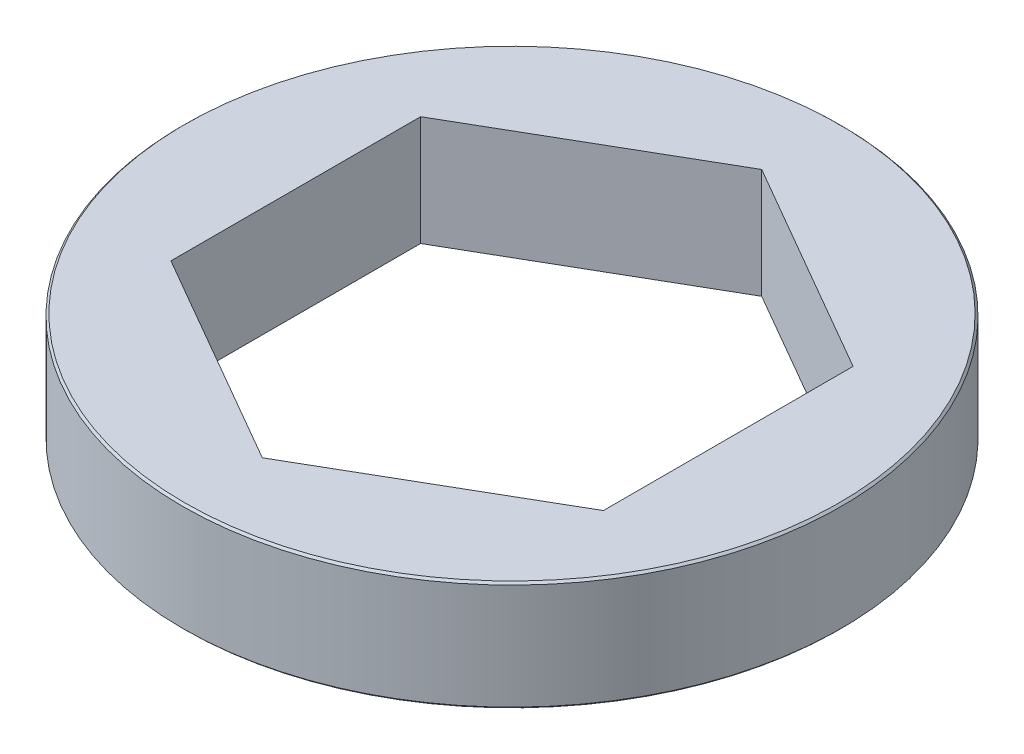
ISO-10303-21;
HEADER;
FILE_DESCRIPTION(('STEP AP214'),'2;1');
FILE_NAME('part.step','',(''),(''),'','','');
FILE_SCHEMA(('AUTOMOTIVE_DESIGN { 1 0 10303 214 1 1 1 1 }'));
ENDSEC;
DATA;
#1=APPLICATION_CONTEXT('core data for automotive mechanical design processes');
#2=APPLICATION_PROTOCOL_DEFINITION('international standard','automotive_design',2000,#1);
#3=PRODUCT_CONTEXT('',#1,'mechanical');
#4=PRODUCT('Part','Part','',(#3));
#5=PRODUCT_RELATED_PRODUCT_CATEGORY('part','',(#4));
#6=PRODUCT_DEFINITION_FORMATION('','',#4);
#7=PRODUCT_DEFINITION_CONTEXT('part definition',#1,'design');
#8=PRODUCT_DEFINITION('design','',#6,#7);
#9=PRODUCT_DEFINITION_SHAPE('','',#8);
#10=(LENGTH_UNIT() NAMED_UNIT(*) SI_UNIT(.MILLI.,.METRE.));
#11=(NAMED_UNIT(*) PLANE_ANGLE_UNIT() SI_UNIT($,.RADIAN.));
#12=(NAMED_UNIT(*) SI_UNIT($,.STERADIAN.) SOLID_ANGLE_UNIT());
#13=UNCERTAINTY_MEASURE_WITH_UNIT(LENGTH_MEASURE(1.E-05),#10,'distance_accuracy_value','');
#14=(GEOMETRIC_REPRESENTATION_CONTEXT(3) GLOBAL_UNCERTAINTY_ASSIGNED_CONTEXT((#13)) GLOBAL_UNIT_ASSIGNED_CONTEXT((#10,
#11,#12)) REPRESENTATION_CONTEXT('',''));
#15=CARTESIAN_POINT('',(0.,0.,0.));
#16=DIRECTION('',(0.,0.,1.));
#17=DIRECTION('',(1.,0.,0.));
#18=AXIS2_PLACEMENT_3D('',#15,#16,#17);
#19=CARTESIAN_POINT('',(0.,3.175,0.));
#20=DIRECTION('',(0.,1.,0.));
#21=DIRECTION('',(0.,0.,1.));
#22=AXIS2_PLACEMENT_3D('',#19,#20,#21);
#23=PLANE('',#22);
#24=CARTESIAN_POINT('',(0.,3.175,0.));
#25=DIRECTION('',(0.,1.,0.));
#26=DIRECTION('',(0.,0.,1.));
#27=AXIS2_PLACEMENT_3D('',#24,#25,#26);
#28=CIRCLE('',#27,9.465);
#29=CARTESIAN_POINT('',(0.,3.175,9.465));
#30=VERTEX_POINT('',#29);
#31=EDGE_CURVE('E41',#30,#30,#28,.T.);
#32=ORIENTED_EDGE('',*,*,#31,.T.);
#33=EDGE_LOOP('',(#32));
#34=FACE_BOUND('',#33,.T.);
#35=DIRECTION('',(-0.866025403784439,0.,0.5));
#36=VECTOR('',#35,1.);
#37=CARTESIAN_POINT('',(0.,3.175,-7.21687836487032));
#38=LINE('',#37,#36);
#39=CARTESIAN_POINT('',(0.,3.175,-7.21687836487032));
#40=VERTEX_POINT('',#39);
#41=CARTESIAN_POINT('',(-6.25,3.175,-3.60843918243516));
#42=VERTEX_POINT('',#41);
#43=EDGE_CURVE('E94',#40,#42,#38,.T.);
#44=ORIENTED_EDGE('',*,*,#43,.F.);
#45=DIRECTION('',(-0.866025403784439,0.,-0.5));
#46=VECTOR('',#45,1.);
#47=CARTESIAN_POINT('',(6.25,3.175,-3.60843918243516));
#48=LINE('',#47,#46);
#49=CARTESIAN_POINT('',(6.25,3.175,-3.60843918243516));
#50=VERTEX_POINT('',#49);
#51=EDGE_CURVE('E86',#50,#40,#48,.T.);
#52=ORIENTED_EDGE('',*,*,#51,.F.);
#53=DIRECTION('',(0.,0.,-1.));
#54=VECTOR('',#53,1.);
#55=CARTESIAN_POINT('',(6.25,3.175,3.60843918243516));
#56=LINE('',#55,#54);
#57=CARTESIAN_POINT('',(6.25,3.175,3.60843918243516));
#58=VERTEX_POINT('',#57);
#59=EDGE_CURVE('E115',#58,#50,#56,.T.);
#60=ORIENTED_EDGE('',*,*,#59,.F.);
#61=DIRECTION('',(0.866025403784439,0.,-0.5));
#62=VECTOR('',#61,1.);
#63=CARTESIAN_POINT('',(0.,3.175,7.21687836487032));
#64=LINE('',#63,#62);
#65=CARTESIAN_POINT('',(0.,3.175,7.21687836487032));
#66=VERTEX_POINT('',#65);
#67=EDGE_CURVE('E113',#66,#58,#64,.T.);
#68=ORIENTED_EDGE('',*,*,#67,.F.);
#69=DIRECTION('',(0.866025403784439,0.,0.5));
#70=VECTOR('',#69,1.);
#71=CARTESIAN_POINT('',(-6.25,3.175,3.60843918243516));
#72=LINE('',#71,#70);
#73=CARTESIAN_POINT('',(-6.25,3.175,3.60843918243516));
#74=VERTEX_POINT('',#73);
#75=EDGE_CURVE('E109',#74,#66,#72,.T.);
#76=ORIENTED_EDGE('',*,*,#75,.F.);
#77=DIRECTION('',(0.,0.,1.));
#78=VECTOR('',#77,1.);
#79=CARTESIAN_POINT('',(-6.25,3.175,-3.60843918243516));
#80=LINE('',#79,#78);
#81=EDGE_CURVE('E107',#42,#74,#80,.T.);
#82=ORIENTED_EDGE('',*,*,#81,.F.);
#83=EDGE_LOOP('',(#44,#52,#60,#68,#76,#82));
#84=FACE_BOUND('',#83,.T.);
#85=ADVANCED_FACE('F33',(#34,#84),#23,.T.);
#86=CARTESIAN_POINT('',(0.,0.,0.));
#87=DIRECTION('',(0.,1.,0.));
#88=DIRECTION('',(0.,0.,1.));
#89=AXIS2_PLACEMENT_3D('',#86,#87,#88);
#90=PLANE('',#89);
#91=CARTESIAN_POINT('',(0.,0.,0.));
#92=DIRECTION('',(0.,1.,0.));
#93=DIRECTION('',(0.,0.,1.));
#94=AXIS2_PLACEMENT_3D('',#91,#92,#93);
#95=CIRCLE('',#94,9.465);
#96=CARTESIAN_POINT('',(0.,0.,9.465));
#97=VERTEX_POINT('',#96);
#98=EDGE_CURVE('E139',#97,#97,#95,.F.);
#99=ORIENTED_EDGE('',*,*,#98,.T.);
#100=EDGE_LOOP('',(#99));
#101=FACE_BOUND('',#100,.T.);
#102=DIRECTION('',(-0.866025403784439,0.,-0.5));
#103=VECTOR('',#102,1.);
#104=CARTESIAN_POINT('',(6.25,0.,-3.60843918243516));
#105=LINE('',#104,#103);
#106=CARTESIAN_POINT('',(6.25,0.,-3.60843918243516));
#107=VERTEX_POINT('',#106);
#108=CARTESIAN_POINT('',(0.,0.,-7.21687836487032));
#109=VERTEX_POINT('',#108);
#110=EDGE_CURVE('E56',#107,#109,#105,.T.);
#111=ORIENTED_EDGE('',*,*,#110,.T.);
#112=DIRECTION('',(-0.866025403784439,0.,0.5));
#113=VECTOR('',#112,1.);
#114=CARTESIAN_POINT('',(0.,0.,-7.21687836487032));
#115=LINE('',#114,#113);
#116=CARTESIAN_POINT('',(-6.25,0.,-3.60843918243516));
#117=VERTEX_POINT('',#116);
#118=EDGE_CURVE('E101',#109,#117,#115,.T.);
#119=ORIENTED_EDGE('',*,*,#118,.T.);
#120=DIRECTION('',(0.,0.,1.));
#121=VECTOR('',#120,1.);
#122=CARTESIAN_POINT('',(-6.25,0.,-3.60843918243516));
#123=LINE('',#122,#121);
#124=CARTESIAN_POINT('',(-6.25,0.,3.60843918243516));
#125=VERTEX_POINT('',#124);
#126=EDGE_CURVE('E119',#117,#125,#123,.T.);
#127=ORIENTED_EDGE('',*,*,#126,.T.);
#128=DIRECTION('',(0.866025403784439,0.,0.5));
#129=VECTOR('',#128,1.);
#130=CARTESIAN_POINT('',(-6.25,0.,3.60843918243516));
#131=LINE('',#130,#129);
#132=CARTESIAN_POINT('',(0.,0.,7.21687836487032));
#133=VERTEX_POINT('',#132);
#134=EDGE_CURVE('E122',#125,#133,#131,.T.);
#135=ORIENTED_EDGE('',*,*,#134,.T.);
#136=DIRECTION('',(0.866025403784439,0.,-0.5));
#137=VECTOR('',#136,1.);
#138=CARTESIAN_POINT('',(0.,0.,7.21687836487032));
#139=LINE('',#138,#137);
#140=CARTESIAN_POINT('',(6.25,0.,3.60843918243516));
#141=VERTEX_POINT('',#140);
#142=EDGE_CURVE('E125',#133,#141,#139,.T.);
#143=ORIENTED_EDGE('',*,*,#142,.T.);
#144=DIRECTION('',(0.,0.,-1.));
#145=VECTOR('',#144,1.);
#146=CARTESIAN_POINT('',(6.25,0.,3.60843918243516));
#147=LINE('',#146,#145);
#148=EDGE_CURVE('E95',#141,#107,#147,.T.);
#149=ORIENTED_EDGE('',*,*,#148,.T.);
#150=EDGE_LOOP('',(#111,#119,#127,#135,#143,#149));
#151=FACE_BOUND('',#150,.T.);
#152=ADVANCED_FACE('F155',(#101,#151),#90,.F.);
#153=CARTESIAN_POINT('',(0.,3.175,0.));
#154=DIRECTION('',(0.,-1.,0.));
#155=DIRECTION('',(0.,0.,-1.));
#156=AXIS2_PLACEMENT_3D('',#153,#154,#155);
#157=CYLINDRICAL_SURFACE('',#156,9.525);
#158=CARTESIAN_POINT('',(0.,3.115,0.));
#159=DIRECTION('',(0.,1.,0.));
#160=DIRECTION('',(0.,0.,1.));
#161=AXIS2_PLACEMENT_3D('',#158,#159,#160);
#162=CIRCLE('',#161,9.525);
#163=CARTESIAN_POINT('',(0.,3.115,9.525));
#164=VERTEX_POINT('',#163);
#165=EDGE_CURVE('E11',#164,#164,#162,.F.);
#166=ORIENTED_EDGE('',*,*,#165,.T.);
#167=EDGE_LOOP('',(#166));
#168=FACE_BOUND('',#167,.T.);
#169=CARTESIAN_POINT('',(0.,0.0599999999999993,0.));
#170=DIRECTION('',(0.,1.,0.));
#171=DIRECTION('',(0.,0.,1.));
#172=AXIS2_PLACEMENT_3D('',#169,#170,#171);
#173=CIRCLE('',#172,9.525);
#174=CARTESIAN_POINT('',(0.,0.0599999999999993,9.525));
#175=VERTEX_POINT('',#174);
#176=EDGE_CURVE('E102',#175,#175,#173,.T.);
#177=ORIENTED_EDGE('',*,*,#176,.T.);
#178=EDGE_LOOP('',(#177));
#179=FACE_BOUND('',#178,.T.);
#180=ADVANCED_FACE('F160',(#168,#179),#157,.T.);
#181=CARTESIAN_POINT('',(6.25,3.175,-3.60843918243516));
#182=DIRECTION('',(-0.5,0.,0.866025403784439));
#183=DIRECTION('',(0.866025403784439,0.,0.5));
#184=AXIS2_PLACEMENT_3D('',#181,#182,#183);
#185=PLANE('',#184);
#186=ORIENTED_EDGE('',*,*,#110,.F.);
#187=DIRECTION('',(0.,-1.,0.));
#188=VECTOR('',#187,1.);
#189=CARTESIAN_POINT('',(6.25,3.175,-3.60843918243516));
#190=LINE('',#189,#188);
#191=EDGE_CURVE('E90',#50,#107,#190,.T.);
#192=ORIENTED_EDGE('',*,*,#191,.F.);
#193=ORIENTED_EDGE('',*,*,#51,.T.);
#194=DIRECTION('',(0.,-1.,0.));
#195=VECTOR('',#194,1.);
#196=CARTESIAN_POINT('',(0.,3.175,-7.21687836487032));
#197=LINE('',#196,#195);
#198=EDGE_CURVE('E89',#40,#109,#197,.T.);
#199=ORIENTED_EDGE('',*,*,#198,.T.);
#200=EDGE_LOOP('',(#186,#192,#193,#199));
#201=FACE_BOUND('',#200,.T.);
#202=ADVANCED_FACE('F88',(#201),#185,.T.);
#203=CARTESIAN_POINT('',(0.,3.175,-7.21687836487032));
#204=DIRECTION('',(0.5,0.,0.866025403784439));
#205=DIRECTION('',(0.866025403784439,0.,-0.5));
#206=AXIS2_PLACEMENT_3D('',#203,#204,#205);
#207=PLANE('',#206);
#208=ORIENTED_EDGE('',*,*,#118,.F.);
#209=ORIENTED_EDGE('',*,*,#198,.F.);
#210=ORIENTED_EDGE('',*,*,#43,.T.);
#211=DIRECTION('',(0.,-1.,0.));
#212=VECTOR('',#211,1.);
#213=CARTESIAN_POINT('',(-6.25,3.175,-3.60843918243516));
#214=LINE('',#213,#212);
#215=EDGE_CURVE('E103',#42,#117,#214,.T.);
#216=ORIENTED_EDGE('',*,*,#215,.T.);
#217=EDGE_LOOP('',(#208,#209,#210,#216));
#218=FACE_BOUND('',#217,.T.);
#219=ADVANCED_FACE('F98',(#218),#207,.T.);
#220=CARTESIAN_POINT('',(-6.25,3.175,-3.60843918243516));
#221=DIRECTION('',(1.,0.,0.));
#222=DIRECTION('',(0.,0.,-1.));
#223=AXIS2_PLACEMENT_3D('',#220,#221,#222);
#224=PLANE('',#223);
#225=ORIENTED_EDGE('',*,*,#126,.F.);
#226=ORIENTED_EDGE('',*,*,#215,.F.);
#227=ORIENTED_EDGE('',*,*,#81,.T.);
#228=DIRECTION('',(0.,-1.,0.));
#229=VECTOR('',#228,1.);
#230=CARTESIAN_POINT('',(-6.25,3.175,3.60843918243516));
#231=LINE('',#230,#229);
#232=EDGE_CURVE('E134',#74,#125,#231,.T.);
#233=ORIENTED_EDGE('',*,*,#232,.T.);
#234=EDGE_LOOP('',(#225,#226,#227,#233));
#235=FACE_BOUND('',#234,.T.);
#236=ADVANCED_FACE('F177',(#235),#224,.T.);
#237=CARTESIAN_POINT('',(-6.25,3.175,3.60843918243516));
#238=DIRECTION('',(0.5,0.,-0.866025403784439));
#239=DIRECTION('',(-0.866025403784439,0.,-0.5));
#240=AXIS2_PLACEMENT_3D('',#237,#238,#239);
#241=PLANE('',#240);
#242=ORIENTED_EDGE('',*,*,#134,.F.);
#243=ORIENTED_EDGE('',*,*,#232,.F.);
#244=ORIENTED_EDGE('',*,*,#75,.T.);
#245=DIRECTION('',(0.,-1.,0.));
#246=VECTOR('',#245,1.);
#247=CARTESIAN_POINT('',(0.,3.175,7.21687836487032));
#248=LINE('',#247,#246);
#249=EDGE_CURVE('E132',#66,#133,#248,.T.);
#250=ORIENTED_EDGE('',*,*,#249,.T.);
#251=EDGE_LOOP('',(#242,#243,#244,#250));
#252=FACE_BOUND('',#251,.T.);
#253=ADVANCED_FACE('F181',(#252),#241,.T.);
#254=CARTESIAN_POINT('',(0.,3.175,7.21687836487032));
#255=DIRECTION('',(-0.5,0.,-0.866025403784439));
#256=DIRECTION('',(-0.866025403784439,0.,0.5));
#257=AXIS2_PLACEMENT_3D('',#254,#255,#256);
#258=PLANE('',#257);
#259=ORIENTED_EDGE('',*,*,#142,.F.);
#260=ORIENTED_EDGE('',*,*,#249,.F.);
#261=ORIENTED_EDGE('',*,*,#67,.T.);
#262=DIRECTION('',(0.,-1.,0.));
#263=VECTOR('',#262,1.);
#264=CARTESIAN_POINT('',(6.25,3.175,3.60843918243516));
#265=LINE('',#264,#263);
#266=EDGE_CURVE('E48',#58,#141,#265,.T.);
#267=ORIENTED_EDGE('',*,*,#266,.T.);
#268=EDGE_LOOP('',(#259,#260,#261,#267));
#269=FACE_BOUND('',#268,.T.);
#270=ADVANCED_FACE('F187',(#269),#258,.T.);
#271=CARTESIAN_POINT('',(6.25,3.175,3.60843918243516));
#272=DIRECTION('',(-1.,0.,0.));
#273=DIRECTION('',(0.,0.,1.));
#274=AXIS2_PLACEMENT_3D('',#271,#272,#273);
#275=PLANE('',#274);
#276=ORIENTED_EDGE('',*,*,#148,.F.);
#277=ORIENTED_EDGE('',*,*,#266,.F.);
#278=ORIENTED_EDGE('',*,*,#59,.T.);
#279=ORIENTED_EDGE('',*,*,#191,.T.);
#280=EDGE_LOOP('',(#276,#277,#278,#279));
#281=FACE_BOUND('',#280,.T.);
#282=ADVANCED_FACE('F151',(#281),#275,.T.);
#283=CARTESIAN_POINT('',(0.,0.0599999999999993,0.));
#284=DIRECTION('',(0.,1.,0.));
#285=DIRECTION('',(0.,0.,1.));
#286=AXIS2_PLACEMENT_3D('',#283,#284,#285);
#287=CONICAL_SURFACE('',#286,9.525,0.785398163397448);
#288=ORIENTED_EDGE('',*,*,#98,.F.);
#289=EDGE_LOOP('',(#288));
#290=FACE_BOUND('',#289,.T.);
#291=ORIENTED_EDGE('',*,*,#176,.F.);
#292=EDGE_LOOP('',(#291));
#293=FACE_BOUND('',#292,.T.);
#294=ADVANCED_FACE('F146',(#290,#293),#287,.T.);
#295=CARTESIAN_POINT('',(0.,3.175,0.));
#296=DIRECTION('',(0.,-1.,0.));
#297=DIRECTION('',(0.,0.,-1.));
#298=AXIS2_PLACEMENT_3D('',#295,#296,#297);
#299=CONICAL_SURFACE('',#298,9.465,0.785398163397419);
#300=ORIENTED_EDGE('',*,*,#165,.F.);
#301=EDGE_LOOP('',(#300));
#302=FACE_BOUND('',#301,.T.);
#303=ORIENTED_EDGE('',*,*,#31,.F.);
#304=EDGE_LOOP('',(#303));
#305=FACE_BOUND('',#304,.T.);
#306=ADVANCED_FACE('F35',(#302,#305),#299,.T.);
#307=CLOSED_SHELL('',(#85,#152,#180,#202,#219,#236,#253,#270,#282,#294,#306));
#308=MANIFOLD_SOLID_BREP('B2',#307);
#309=ADVANCED_BREP_SHAPE_REPRESENTATION('',(#18,#308),#14);
#310=SHAPE_DEFINITION_REPRESENTATION(#9,#309);
ENDSEC;
END-ISO-10303-21;
